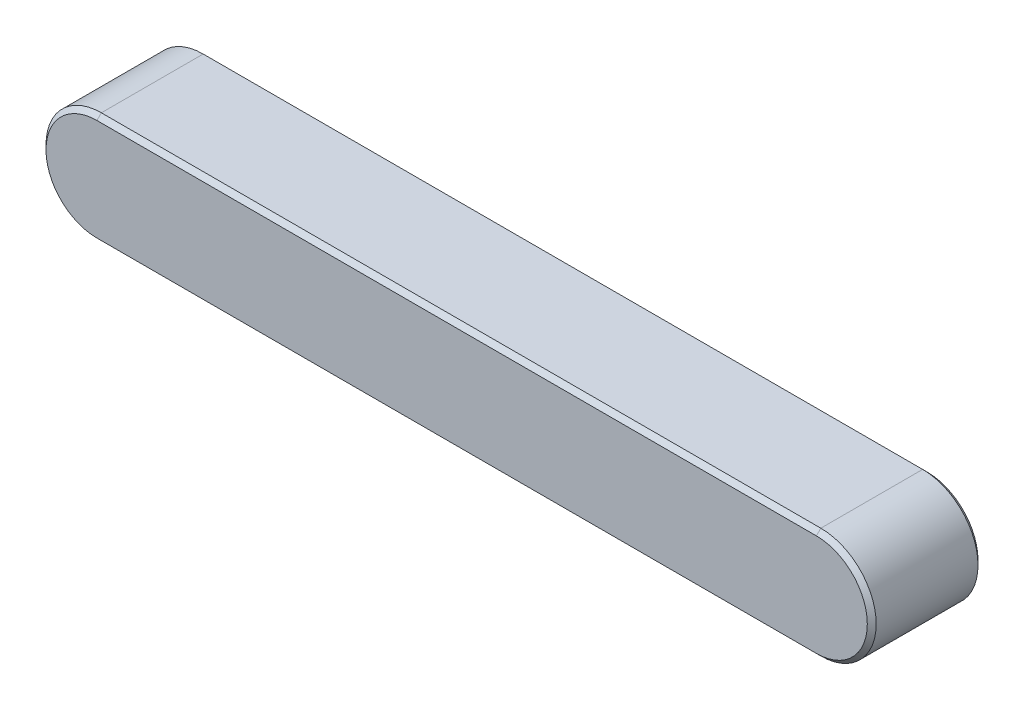
ISO-10303-21;
HEADER;
FILE_DESCRIPTION(('STEP AP214'),'2;1');
FILE_NAME('part.step','',(''),(''),'','','');
FILE_SCHEMA(('AUTOMOTIVE_DESIGN { 1 0 10303 214 1 1 1 1 }'));
ENDSEC;
DATA;
#1=APPLICATION_CONTEXT('core data for automotive mechanical design processes');
#2=APPLICATION_PROTOCOL_DEFINITION('international standard','automotive_design',2000,#1);
#3=PRODUCT_CONTEXT('',#1,'mechanical');
#4=PRODUCT('Part','Part','',(#3));
#5=PRODUCT_RELATED_PRODUCT_CATEGORY('part','',(#4));
#6=PRODUCT_DEFINITION_FORMATION('','',#4);
#7=PRODUCT_DEFINITION_CONTEXT('part definition',#1,'design');
#8=PRODUCT_DEFINITION('design','',#6,#7);
#9=PRODUCT_DEFINITION_SHAPE('','',#8);
#10=(LENGTH_UNIT() NAMED_UNIT(*) SI_UNIT(.MILLI.,.METRE.));
#11=(NAMED_UNIT(*) PLANE_ANGLE_UNIT() SI_UNIT($,.RADIAN.));
#12=(NAMED_UNIT(*) SI_UNIT($,.STERADIAN.) SOLID_ANGLE_UNIT());
#13=UNCERTAINTY_MEASURE_WITH_UNIT(LENGTH_MEASURE(1.E-05),#10,'distance_accuracy_value','');
#14=(GEOMETRIC_REPRESENTATION_CONTEXT(3) GLOBAL_UNCERTAINTY_ASSIGNED_CONTEXT((#13)) GLOBAL_UNIT_ASSIGNED_CONTEXT((#10,
#11,#12)) REPRESENTATION_CONTEXT('',''));
#15=CARTESIAN_POINT('',(0.,0.,0.));
#16=DIRECTION('',(0.,0.,1.));
#17=DIRECTION('',(1.,0.,0.));
#18=AXIS2_PLACEMENT_3D('',#15,#16,#17);
#19=CARTESIAN_POINT('',(-13.,0.,4.));
#20=DIRECTION('',(0.,0.,-1.));
#21=DIRECTION('',(-1.,0.,0.));
#22=AXIS2_PLACEMENT_3D('',#19,#20,#21);
#23=CYLINDRICAL_SURFACE('',#22,2.);
#24=DIRECTION('',(0.,0.,-1.));
#25=VECTOR('',#24,1.);
#26=CARTESIAN_POINT('',(-13.,-2.,4.));
#27=LINE('',#26,#25);
#28=CARTESIAN_POINT('',(-13.,-2.,3.84));
#29=VERTEX_POINT('',#28);
#30=CARTESIAN_POINT('',(-13.,-2.,0.16));
#31=VERTEX_POINT('',#30);
#32=EDGE_CURVE('E126',#29,#31,#27,.T.);
#33=ORIENTED_EDGE('',*,*,#32,.F.);
#34=CARTESIAN_POINT('',(-13.,0.,3.84));
#35=DIRECTION('',(0.,0.,1.));
#36=DIRECTION('',(1.,0.,0.));
#37=AXIS2_PLACEMENT_3D('',#34,#35,#36);
#38=CIRCLE('',#37,2.);
#39=CARTESIAN_POINT('',(-13.,2.,3.84));
#40=VERTEX_POINT('',#39);
#41=EDGE_CURVE('E129',#29,#40,#38,.F.);
#42=ORIENTED_EDGE('',*,*,#41,.T.);
#43=DIRECTION('',(0.,0.,-1.));
#44=VECTOR('',#43,1.);
#45=CARTESIAN_POINT('',(-13.,2.,4.));
#46=LINE('',#45,#44);
#47=CARTESIAN_POINT('',(-13.,2.,0.16));
#48=VERTEX_POINT('',#47);
#49=EDGE_CURVE('E132',#40,#48,#46,.T.);
#50=ORIENTED_EDGE('',*,*,#49,.T.);
#51=CARTESIAN_POINT('',(-13.,0.,0.16));
#52=DIRECTION('',(0.,0.,1.));
#53=DIRECTION('',(1.,0.,0.));
#54=AXIS2_PLACEMENT_3D('',#51,#52,#53);
#55=CIRCLE('',#54,2.);
#56=EDGE_CURVE('E166',#48,#31,#55,.T.);
#57=ORIENTED_EDGE('',*,*,#56,.T.);
#58=EDGE_LOOP('',(#33,#42,#50,#57));
#59=FACE_BOUND('',#58,.T.);
#60=ADVANCED_FACE('F38',(#59),#23,.T.);
#61=CARTESIAN_POINT('',(-13.,-2.,4.));
#62=DIRECTION('',(0.,1.,0.));
#63=DIRECTION('',(0.,0.,1.));
#64=AXIS2_PLACEMENT_3D('',#61,#62,#63);
#65=PLANE('',#64);
#66=DIRECTION('',(0.,0.,-1.));
#67=VECTOR('',#66,1.);
#68=CARTESIAN_POINT('',(13.,-2.,4.));
#69=LINE('',#68,#67);
#70=CARTESIAN_POINT('',(13.,-2.,3.84));
#71=VERTEX_POINT('',#70);
#72=CARTESIAN_POINT('',(13.,-2.,0.16));
#73=VERTEX_POINT('',#72);
#74=EDGE_CURVE('E178',#71,#73,#69,.T.);
#75=ORIENTED_EDGE('',*,*,#74,.F.);
#76=DIRECTION('',(-1.,0.,0.));
#77=VECTOR('',#76,1.);
#78=CARTESIAN_POINT('',(-13.,-2.,3.84));
#79=LINE('',#78,#77);
#80=EDGE_CURVE('E157',#71,#29,#79,.T.);
#81=ORIENTED_EDGE('',*,*,#80,.T.);
#82=ORIENTED_EDGE('',*,*,#32,.T.);
#83=DIRECTION('',(1.,0.,0.));
#84=VECTOR('',#83,1.);
#85=CARTESIAN_POINT('',(-13.,-2.,0.16));
#86=LINE('',#85,#84);
#87=EDGE_CURVE('E159',#31,#73,#86,.T.);
#88=ORIENTED_EDGE('',*,*,#87,.T.);
#89=EDGE_LOOP('',(#75,#81,#82,#88));
#90=FACE_BOUND('',#89,.T.);
#91=ADVANCED_FACE('F200',(#90),#65,.F.);
#92=CARTESIAN_POINT('',(13.,0.,4.));
#93=DIRECTION('',(0.,0.,-1.));
#94=DIRECTION('',(-1.,0.,0.));
#95=AXIS2_PLACEMENT_3D('',#92,#93,#94);
#96=CYLINDRICAL_SURFACE('',#95,2.);
#97=DIRECTION('',(0.,0.,-1.));
#98=VECTOR('',#97,1.);
#99=CARTESIAN_POINT('',(13.,2.,4.));
#100=LINE('',#99,#98);
#101=CARTESIAN_POINT('',(13.,2.,3.84));
#102=VERTEX_POINT('',#101);
#103=CARTESIAN_POINT('',(13.,2.,0.16));
#104=VERTEX_POINT('',#103);
#105=EDGE_CURVE('E181',#102,#104,#100,.T.);
#106=ORIENTED_EDGE('',*,*,#105,.F.);
#107=CARTESIAN_POINT('',(13.,0.,3.84));
#108=DIRECTION('',(0.,0.,1.));
#109=DIRECTION('',(1.,0.,0.));
#110=AXIS2_PLACEMENT_3D('',#107,#108,#109);
#111=CIRCLE('',#110,2.);
#112=EDGE_CURVE('E161',#102,#71,#111,.F.);
#113=ORIENTED_EDGE('',*,*,#112,.T.);
#114=ORIENTED_EDGE('',*,*,#74,.T.);
#115=CARTESIAN_POINT('',(13.,0.,0.16));
#116=DIRECTION('',(0.,0.,1.));
#117=DIRECTION('',(1.,0.,0.));
#118=AXIS2_PLACEMENT_3D('',#115,#116,#117);
#119=CIRCLE('',#118,2.);
#120=EDGE_CURVE('E163',#73,#104,#119,.T.);
#121=ORIENTED_EDGE('',*,*,#120,.T.);
#122=EDGE_LOOP('',(#106,#113,#114,#121));
#123=FACE_BOUND('',#122,.T.);
#124=ADVANCED_FACE('F198',(#123),#96,.T.);
#125=CARTESIAN_POINT('',(-13.,2.,4.));
#126=DIRECTION('',(0.,-1.,0.));
#127=DIRECTION('',(1.,0.,0.));
#128=AXIS2_PLACEMENT_3D('',#125,#126,#127);
#129=PLANE('',#128);
#130=ORIENTED_EDGE('',*,*,#49,.F.);
#131=DIRECTION('',(1.,0.,0.));
#132=VECTOR('',#131,1.);
#133=CARTESIAN_POINT('',(13.,2.,3.84));
#134=LINE('',#133,#132);
#135=EDGE_CURVE('E168',#40,#102,#134,.T.);
#136=ORIENTED_EDGE('',*,*,#135,.T.);
#137=ORIENTED_EDGE('',*,*,#105,.T.);
#138=DIRECTION('',(-1.,0.,0.));
#139=VECTOR('',#138,1.);
#140=CARTESIAN_POINT('',(-13.,2.,0.16));
#141=LINE('',#140,#139);
#142=EDGE_CURVE('E171',#104,#48,#141,.T.);
#143=ORIENTED_EDGE('',*,*,#142,.T.);
#144=EDGE_LOOP('',(#130,#136,#137,#143));
#145=FACE_BOUND('',#144,.T.);
#146=ADVANCED_FACE('F189',(#145),#129,.F.);
#147=CARTESIAN_POINT('',(-13.,0.,4.));
#148=DIRECTION('',(0.,0.,1.));
#149=DIRECTION('',(1.,0.,0.));
#150=AXIS2_PLACEMENT_3D('',#147,#148,#149);
#151=PLANE('',#150);
#152=CARTESIAN_POINT('',(13.,0.,4.));
#153=DIRECTION('',(0.,0.,1.));
#154=DIRECTION('',(1.,0.,0.));
#155=AXIS2_PLACEMENT_3D('',#152,#153,#154);
#156=CIRCLE('',#155,1.84);
#157=CARTESIAN_POINT('',(13.,-1.84,4.));
#158=VERTEX_POINT('',#157);
#159=CARTESIAN_POINT('',(13.,1.84,4.));
#160=VERTEX_POINT('',#159);
#161=EDGE_CURVE('E115',#158,#160,#156,.T.);
#162=ORIENTED_EDGE('',*,*,#161,.T.);
#163=DIRECTION('',(-1.,0.,0.));
#164=VECTOR('',#163,1.);
#165=CARTESIAN_POINT('',(-13.,1.84,4.));
#166=LINE('',#165,#164);
#167=CARTESIAN_POINT('',(-13.,1.84,4.));
#168=VERTEX_POINT('',#167);
#169=EDGE_CURVE('E111',#160,#168,#166,.T.);
#170=ORIENTED_EDGE('',*,*,#169,.T.);
#171=CARTESIAN_POINT('',(-13.,0.,4.));
#172=DIRECTION('',(0.,0.,1.));
#173=DIRECTION('',(1.,0.,0.));
#174=AXIS2_PLACEMENT_3D('',#171,#172,#173);
#175=CIRCLE('',#174,1.84);
#176=CARTESIAN_POINT('',(-13.,-1.84,4.));
#177=VERTEX_POINT('',#176);
#178=EDGE_CURVE('E105',#168,#177,#175,.T.);
#179=ORIENTED_EDGE('',*,*,#178,.T.);
#180=DIRECTION('',(1.,0.,0.));
#181=VECTOR('',#180,1.);
#182=CARTESIAN_POINT('',(13.,-1.84,4.));
#183=LINE('',#182,#181);
#184=EDGE_CURVE('E108',#177,#158,#183,.T.);
#185=ORIENTED_EDGE('',*,*,#184,.T.);
#186=EDGE_LOOP('',(#162,#170,#179,#185));
#187=FACE_BOUND('',#186,.T.);
#188=ADVANCED_FACE('F107',(#187),#151,.T.);
#189=CARTESIAN_POINT('',(-13.,0.,0.));
#190=DIRECTION('',(0.,0.,1.));
#191=DIRECTION('',(1.,0.,0.));
#192=AXIS2_PLACEMENT_3D('',#189,#190,#191);
#193=PLANE('',#192);
#194=CARTESIAN_POINT('',(-13.,0.,0.));
#195=DIRECTION('',(0.,0.,1.));
#196=DIRECTION('',(1.,0.,0.));
#197=AXIS2_PLACEMENT_3D('',#194,#195,#196);
#198=CIRCLE('',#197,1.84);
#199=CARTESIAN_POINT('',(-13.,-1.84,0.));
#200=VERTEX_POINT('',#199);
#201=CARTESIAN_POINT('',(-13.,1.84,0.));
#202=VERTEX_POINT('',#201);
#203=EDGE_CURVE('E47',#200,#202,#198,.F.);
#204=ORIENTED_EDGE('',*,*,#203,.T.);
#205=DIRECTION('',(1.,0.,0.));
#206=VECTOR('',#205,1.);
#207=CARTESIAN_POINT('',(-13.,1.84,0.));
#208=LINE('',#207,#206);
#209=CARTESIAN_POINT('',(13.,1.84,0.));
#210=VERTEX_POINT('',#209);
#211=EDGE_CURVE('E11',#202,#210,#208,.T.);
#212=ORIENTED_EDGE('',*,*,#211,.T.);
#213=CARTESIAN_POINT('',(13.,0.,0.));
#214=DIRECTION('',(0.,0.,1.));
#215=DIRECTION('',(1.,0.,0.));
#216=AXIS2_PLACEMENT_3D('',#213,#214,#215);
#217=CIRCLE('',#216,1.84);
#218=CARTESIAN_POINT('',(13.,-1.84,0.));
#219=VERTEX_POINT('',#218);
#220=EDGE_CURVE('E153',#210,#219,#217,.F.);
#221=ORIENTED_EDGE('',*,*,#220,.T.);
#222=DIRECTION('',(-1.,0.,0.));
#223=VECTOR('',#222,1.);
#224=CARTESIAN_POINT('',(-13.,-1.84,0.));
#225=LINE('',#224,#223);
#226=EDGE_CURVE('E155',#219,#200,#225,.T.);
#227=ORIENTED_EDGE('',*,*,#226,.T.);
#228=EDGE_LOOP('',(#204,#212,#221,#227));
#229=FACE_BOUND('',#228,.T.);
#230=ADVANCED_FACE('F230',(#229),#193,.F.);
#231=CARTESIAN_POINT('',(-13.,-1.84,4.));
#232=DIRECTION('',(0.,-0.707106781186555,0.70710678118654));
#233=DIRECTION('',(-1.,0.,0.));
#234=AXIS2_PLACEMENT_3D('',#231,#232,#233);
#235=PLANE('',#234);
#236=DIRECTION('',(0.,0.70710678118654,0.707106781186555));
#237=VECTOR('',#236,1.);
#238=CARTESIAN_POINT('',(-13.,-2.,3.84));
#239=LINE('',#238,#237);
#240=EDGE_CURVE('E121',#29,#177,#239,.T.);
#241=ORIENTED_EDGE('',*,*,#240,.F.);
#242=ORIENTED_EDGE('',*,*,#80,.F.);
#243=DIRECTION('',(0.,-0.70710678118654,-0.707106781186555));
#244=VECTOR('',#243,1.);
#245=CARTESIAN_POINT('',(13.,-1.84,4.));
#246=LINE('',#245,#244);
#247=EDGE_CURVE('E124',#158,#71,#246,.T.);
#248=ORIENTED_EDGE('',*,*,#247,.F.);
#249=ORIENTED_EDGE('',*,*,#184,.F.);
#250=EDGE_LOOP('',(#241,#242,#248,#249));
#251=FACE_BOUND('',#250,.T.);
#252=ADVANCED_FACE('F119',(#251),#235,.T.);
#253=CARTESIAN_POINT('',(13.,0.,4.));
#254=DIRECTION('',(0.,0.,-1.));
#255=DIRECTION('',(-1.,0.,0.));
#256=AXIS2_PLACEMENT_3D('',#253,#254,#255);
#257=CONICAL_SURFACE('',#256,1.84,0.785398163397438);
#258=ORIENTED_EDGE('',*,*,#247,.T.);
#259=ORIENTED_EDGE('',*,*,#112,.F.);
#260=DIRECTION('',(0.,0.70710678118654,-0.707106781186555));
#261=VECTOR('',#260,1.);
#262=CARTESIAN_POINT('',(13.,1.84,4.));
#263=LINE('',#262,#261);
#264=EDGE_CURVE('E130',#160,#102,#263,.T.);
#265=ORIENTED_EDGE('',*,*,#264,.F.);
#266=ORIENTED_EDGE('',*,*,#161,.F.);
#267=EDGE_LOOP('',(#258,#259,#265,#266));
#268=FACE_BOUND('',#267,.T.);
#269=ADVANCED_FACE('F195',(#268),#257,.T.);
#270=CARTESIAN_POINT('',(-13.,0.,4.));
#271=DIRECTION('',(0.,0.,-1.));
#272=DIRECTION('',(-1.,0.,0.));
#273=AXIS2_PLACEMENT_3D('',#270,#271,#272);
#274=CONICAL_SURFACE('',#273,1.84,0.785398163397438);
#275=ORIENTED_EDGE('',*,*,#240,.T.);
#276=ORIENTED_EDGE('',*,*,#178,.F.);
#277=DIRECTION('',(0.,-0.70710678118654,0.707106781186555));
#278=VECTOR('',#277,1.);
#279=CARTESIAN_POINT('',(-13.,2.,3.84));
#280=LINE('',#279,#278);
#281=EDGE_CURVE('E134',#40,#168,#280,.T.);
#282=ORIENTED_EDGE('',*,*,#281,.F.);
#283=ORIENTED_EDGE('',*,*,#41,.F.);
#284=EDGE_LOOP('',(#275,#276,#282,#283));
#285=FACE_BOUND('',#284,.T.);
#286=ADVANCED_FACE('F128',(#285),#274,.T.);
#287=CARTESIAN_POINT('',(-13.,1.84,4.));
#288=DIRECTION('',(0.,0.707106781186555,0.70710678118654));
#289=DIRECTION('',(1.,0.,0.));
#290=AXIS2_PLACEMENT_3D('',#287,#288,#289);
#291=PLANE('',#290);
#292=ORIENTED_EDGE('',*,*,#264,.T.);
#293=ORIENTED_EDGE('',*,*,#135,.F.);
#294=ORIENTED_EDGE('',*,*,#281,.T.);
#295=ORIENTED_EDGE('',*,*,#169,.F.);
#296=EDGE_LOOP('',(#292,#293,#294,#295));
#297=FACE_BOUND('',#296,.T.);
#298=ADVANCED_FACE('F191',(#297),#291,.T.);
#299=CARTESIAN_POINT('',(-13.,-2.,0.16));
#300=DIRECTION('',(0.,0.70710678118654,0.707106781186555));
#301=DIRECTION('',(1.,0.,0.));
#302=AXIS2_PLACEMENT_3D('',#299,#300,#301);
#303=PLANE('',#302);
#304=DIRECTION('',(0.,-0.707106781186555,0.70710678118654));
#305=VECTOR('',#304,1.);
#306=CARTESIAN_POINT('',(-13.,-1.84,0.));
#307=LINE('',#306,#305);
#308=EDGE_CURVE('E140',#200,#31,#307,.T.);
#309=ORIENTED_EDGE('',*,*,#308,.F.);
#310=ORIENTED_EDGE('',*,*,#226,.F.);
#311=DIRECTION('',(0.,0.707106781186555,-0.70710678118654));
#312=VECTOR('',#311,1.);
#313=CARTESIAN_POINT('',(13.,-2.,0.16));
#314=LINE('',#313,#312);
#315=EDGE_CURVE('E42',#73,#219,#314,.T.);
#316=ORIENTED_EDGE('',*,*,#315,.F.);
#317=ORIENTED_EDGE('',*,*,#87,.F.);
#318=EDGE_LOOP('',(#309,#310,#316,#317));
#319=FACE_BOUND('',#318,.T.);
#320=ADVANCED_FACE('F40',(#319),#303,.F.);
#321=CARTESIAN_POINT('',(13.,0.,0.16));
#322=DIRECTION('',(0.,0.,1.));
#323=DIRECTION('',(1.,0.,0.));
#324=AXIS2_PLACEMENT_3D('',#321,#322,#323);
#325=CONICAL_SURFACE('',#324,2.,0.785398163397459);
#326=ORIENTED_EDGE('',*,*,#315,.T.);
#327=ORIENTED_EDGE('',*,*,#220,.F.);
#328=DIRECTION('',(0.,-0.707106781186555,-0.70710678118654));
#329=VECTOR('',#328,1.);
#330=CARTESIAN_POINT('',(13.,2.,0.16));
#331=LINE('',#330,#329);
#332=EDGE_CURVE('E60',#104,#210,#331,.T.);
#333=ORIENTED_EDGE('',*,*,#332,.F.);
#334=ORIENTED_EDGE('',*,*,#120,.F.);
#335=EDGE_LOOP('',(#326,#327,#333,#334));
#336=FACE_BOUND('',#335,.T.);
#337=ADVANCED_FACE('F204',(#336),#325,.T.);
#338=CARTESIAN_POINT('',(-13.,0.,0.16));
#339=DIRECTION('',(0.,0.,1.));
#340=DIRECTION('',(1.,0.,0.));
#341=AXIS2_PLACEMENT_3D('',#338,#339,#340);
#342=CONICAL_SURFACE('',#341,2.,0.785398163397459);
#343=ORIENTED_EDGE('',*,*,#308,.T.);
#344=ORIENTED_EDGE('',*,*,#56,.F.);
#345=DIRECTION('',(0.,0.707106781186555,0.70710678118654));
#346=VECTOR('',#345,1.);
#347=CARTESIAN_POINT('',(-13.,1.84,0.));
#348=LINE('',#347,#346);
#349=EDGE_CURVE('E138',#202,#48,#348,.T.);
#350=ORIENTED_EDGE('',*,*,#349,.F.);
#351=ORIENTED_EDGE('',*,*,#203,.F.);
#352=EDGE_LOOP('',(#343,#344,#350,#351));
#353=FACE_BOUND('',#352,.T.);
#354=ADVANCED_FACE('F207',(#353),#342,.T.);
#355=CARTESIAN_POINT('',(-13.,2.,0.16));
#356=DIRECTION('',(0.,-0.70710678118654,0.707106781186555));
#357=DIRECTION('',(-1.,0.,0.));
#358=AXIS2_PLACEMENT_3D('',#355,#356,#357);
#359=PLANE('',#358);
#360=ORIENTED_EDGE('',*,*,#332,.T.);
#361=ORIENTED_EDGE('',*,*,#211,.F.);
#362=ORIENTED_EDGE('',*,*,#349,.T.);
#363=ORIENTED_EDGE('',*,*,#142,.F.);
#364=EDGE_LOOP('',(#360,#361,#362,#363));
#365=FACE_BOUND('',#364,.T.);
#366=ADVANCED_FACE('F205',(#365),#359,.F.);
#367=CLOSED_SHELL('',(#60,#91,#124,#146,#188,#230,#252,#269,#286,#298,#320,#337,#354,#366));
#368=MANIFOLD_SOLID_BREP('B2',#367);
#369=ADVANCED_BREP_SHAPE_REPRESENTATION('',(#18,#368),#14);
#370=SHAPE_DEFINITION_REPRESENTATION(#9,#369);
ENDSEC;
END-ISO-10303-21;
